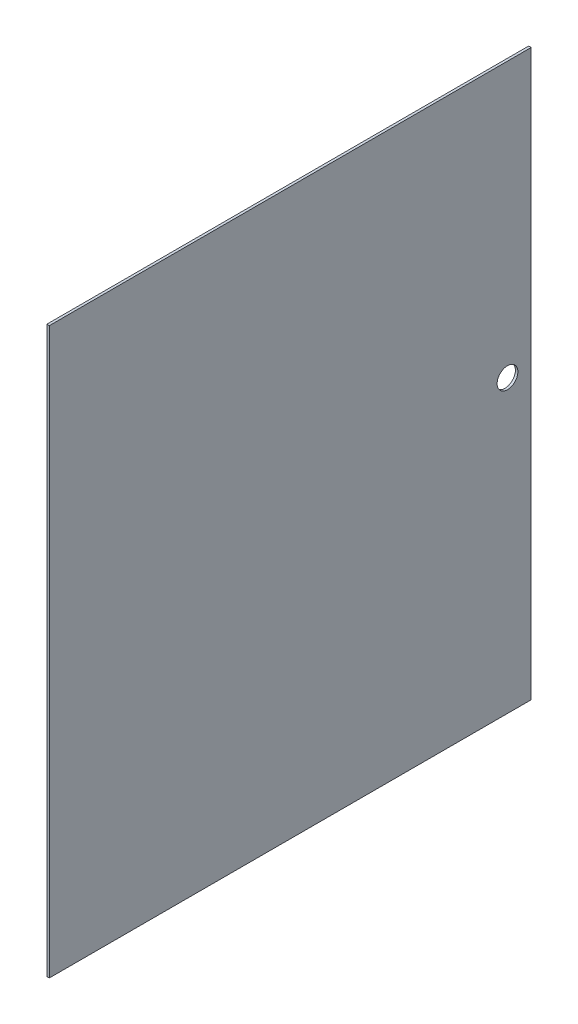
ISO-10303-21;
HEADER;
FILE_DESCRIPTION(('STEP AP214'),'2;1');
FILE_NAME('part.step','',(''),(''),'','','');
FILE_SCHEMA(('AUTOMOTIVE_DESIGN { 1 0 10303 214 1 1 1 1 }'));
ENDSEC;
DATA;
#1=APPLICATION_CONTEXT('core data for automotive mechanical design processes');
#2=APPLICATION_PROTOCOL_DEFINITION('international standard','automotive_design',2000,#1);
#3=PRODUCT_CONTEXT('',#1,'mechanical');
#4=PRODUCT('Part','Part','',(#3));
#5=PRODUCT_RELATED_PRODUCT_CATEGORY('part','',(#4));
#6=PRODUCT_DEFINITION_FORMATION('','',#4);
#7=PRODUCT_DEFINITION_CONTEXT('part definition',#1,'design');
#8=PRODUCT_DEFINITION('design','',#6,#7);
#9=PRODUCT_DEFINITION_SHAPE('','',#8);
#10=(LENGTH_UNIT() NAMED_UNIT(*) SI_UNIT(.MILLI.,.METRE.));
#11=(NAMED_UNIT(*) PLANE_ANGLE_UNIT() SI_UNIT($,.RADIAN.));
#12=(NAMED_UNIT(*) SI_UNIT($,.STERADIAN.) SOLID_ANGLE_UNIT());
#13=UNCERTAINTY_MEASURE_WITH_UNIT(LENGTH_MEASURE(1.E-05),#10,'distance_accuracy_value','');
#14=(GEOMETRIC_REPRESENTATION_CONTEXT(3) GLOBAL_UNCERTAINTY_ASSIGNED_CONTEXT((#13)) GLOBAL_UNIT_ASSIGNED_CONTEXT((#10,
#11,#12)) REPRESENTATION_CONTEXT('',''));
#15=CARTESIAN_POINT('',(0.,0.,0.));
#16=DIRECTION('',(0.,0.,1.));
#17=DIRECTION('',(1.,0.,0.));
#18=AXIS2_PLACEMENT_3D('',#15,#16,#17);
#19=CARTESIAN_POINT('',(3.,-340.,290.));
#20=DIRECTION('',(0.,0.,-1.));
#21=DIRECTION('',(-1.,0.,0.));
#22=AXIS2_PLACEMENT_3D('',#19,#20,#21);
#23=PLANE('',#22);
#24=DIRECTION('',(0.,-1.,0.));
#25=VECTOR('',#24,1.);
#26=CARTESIAN_POINT('',(0.,-340.,290.));
#27=LINE('',#26,#25);
#28=CARTESIAN_POINT('',(0.,340.,290.));
#29=VERTEX_POINT('',#28);
#30=CARTESIAN_POINT('',(0.,-340.,290.));
#31=VERTEX_POINT('',#30);
#32=EDGE_CURVE('E111',#29,#31,#27,.T.);
#33=ORIENTED_EDGE('',*,*,#32,.T.);
#34=DIRECTION('',(-1.,0.,0.));
#35=VECTOR('',#34,1.);
#36=CARTESIAN_POINT('',(3.,-340.,290.));
#37=LINE('',#36,#35);
#38=CARTESIAN_POINT('',(3.,-340.,290.));
#39=VERTEX_POINT('',#38);
#40=EDGE_CURVE('E11',#39,#31,#37,.T.);
#41=ORIENTED_EDGE('',*,*,#40,.F.);
#42=DIRECTION('',(0.,-1.,0.));
#43=VECTOR('',#42,1.);
#44=CARTESIAN_POINT('',(3.,-340.,290.));
#45=LINE('',#44,#43);
#46=CARTESIAN_POINT('',(3.,340.,290.));
#47=VERTEX_POINT('',#46);
#48=EDGE_CURVE('E95',#47,#39,#45,.T.);
#49=ORIENTED_EDGE('',*,*,#48,.F.);
#50=DIRECTION('',(-1.,0.,0.));
#51=VECTOR('',#50,1.);
#52=CARTESIAN_POINT('',(3.,340.,290.));
#53=LINE('',#52,#51);
#54=EDGE_CURVE('E107',#47,#29,#53,.T.);
#55=ORIENTED_EDGE('',*,*,#54,.T.);
#56=EDGE_LOOP('',(#33,#41,#49,#55));
#57=FACE_BOUND('',#56,.T.);
#58=ADVANCED_FACE('F43',(#57),#23,.F.);
#59=CARTESIAN_POINT('',(3.,-340.,-290.));
#60=DIRECTION('',(0.,1.,0.));
#61=DIRECTION('',(0.,0.,1.));
#62=AXIS2_PLACEMENT_3D('',#59,#60,#61);
#63=PLANE('',#62);
#64=DIRECTION('',(0.,0.,-1.));
#65=VECTOR('',#64,1.);
#66=CARTESIAN_POINT('',(0.,-340.,-290.));
#67=LINE('',#66,#65);
#68=CARTESIAN_POINT('',(0.,-340.,-290.));
#69=VERTEX_POINT('',#68);
#70=EDGE_CURVE('E100',#31,#69,#67,.T.);
#71=ORIENTED_EDGE('',*,*,#70,.T.);
#72=DIRECTION('',(-1.,0.,0.));
#73=VECTOR('',#72,1.);
#74=CARTESIAN_POINT('',(3.,-340.,-290.));
#75=LINE('',#74,#73);
#76=CARTESIAN_POINT('',(3.,-340.,-290.));
#77=VERTEX_POINT('',#76);
#78=EDGE_CURVE('E52',#77,#69,#75,.T.);
#79=ORIENTED_EDGE('',*,*,#78,.F.);
#80=DIRECTION('',(0.,0.,-1.));
#81=VECTOR('',#80,1.);
#82=CARTESIAN_POINT('',(3.,-340.,-290.));
#83=LINE('',#82,#81);
#84=EDGE_CURVE('E90',#39,#77,#83,.T.);
#85=ORIENTED_EDGE('',*,*,#84,.F.);
#86=ORIENTED_EDGE('',*,*,#40,.T.);
#87=EDGE_LOOP('',(#71,#79,#85,#86));
#88=FACE_BOUND('',#87,.T.);
#89=ADVANCED_FACE('F99',(#88),#63,.F.);
#90=CARTESIAN_POINT('',(3.,-340.,-290.));
#91=DIRECTION('',(0.,0.,1.));
#92=DIRECTION('',(1.,0.,0.));
#93=AXIS2_PLACEMENT_3D('',#90,#91,#92);
#94=PLANE('',#93);
#95=DIRECTION('',(0.,1.,0.));
#96=VECTOR('',#95,1.);
#97=CARTESIAN_POINT('',(0.,-340.,-290.));
#98=LINE('',#97,#96);
#99=CARTESIAN_POINT('',(0.,340.,-290.));
#100=VERTEX_POINT('',#99);
#101=EDGE_CURVE('E77',#69,#100,#98,.T.);
#102=ORIENTED_EDGE('',*,*,#101,.T.);
#103=DIRECTION('',(-1.,0.,0.));
#104=VECTOR('',#103,1.);
#105=CARTESIAN_POINT('',(3.,340.,-290.));
#106=LINE('',#105,#104);
#107=CARTESIAN_POINT('',(3.,340.,-290.));
#108=VERTEX_POINT('',#107);
#109=EDGE_CURVE('E102',#108,#100,#106,.T.);
#110=ORIENTED_EDGE('',*,*,#109,.F.);
#111=DIRECTION('',(0.,1.,0.));
#112=VECTOR('',#111,1.);
#113=CARTESIAN_POINT('',(3.,-340.,-290.));
#114=LINE('',#113,#112);
#115=EDGE_CURVE('E93',#77,#108,#114,.T.);
#116=ORIENTED_EDGE('',*,*,#115,.F.);
#117=ORIENTED_EDGE('',*,*,#78,.T.);
#118=EDGE_LOOP('',(#102,#110,#116,#117));
#119=FACE_BOUND('',#118,.T.);
#120=ADVANCED_FACE('F103',(#119),#94,.F.);
#121=CARTESIAN_POINT('',(3.,340.,-290.));
#122=DIRECTION('',(0.,-1.,0.));
#123=DIRECTION('',(0.,0.,-1.));
#124=AXIS2_PLACEMENT_3D('',#121,#122,#123);
#125=PLANE('',#124);
#126=DIRECTION('',(0.,0.,1.));
#127=VECTOR('',#126,1.);
#128=CARTESIAN_POINT('',(0.,340.,-290.));
#129=LINE('',#128,#127);
#130=EDGE_CURVE('E83',#100,#29,#129,.T.);
#131=ORIENTED_EDGE('',*,*,#130,.T.);
#132=ORIENTED_EDGE('',*,*,#54,.F.);
#133=DIRECTION('',(0.,0.,1.));
#134=VECTOR('',#133,1.);
#135=CARTESIAN_POINT('',(3.,340.,-290.));
#136=LINE('',#135,#134);
#137=EDGE_CURVE('E60',#108,#47,#136,.T.);
#138=ORIENTED_EDGE('',*,*,#137,.F.);
#139=ORIENTED_EDGE('',*,*,#109,.T.);
#140=EDGE_LOOP('',(#131,#132,#138,#139));
#141=FACE_BOUND('',#140,.T.);
#142=ADVANCED_FACE('F125',(#141),#125,.F.);
#143=CARTESIAN_POINT('',(3.,0.,0.));
#144=DIRECTION('',(1.,0.,0.));
#145=DIRECTION('',(0.,0.,-1.));
#146=AXIS2_PLACEMENT_3D('',#143,#144,#145);
#147=PLANE('',#146);
#148=CARTESIAN_POINT('',(3.,10.0000000000001,-261.5));
#149=DIRECTION('',(1.,0.,0.));
#150=DIRECTION('',(0.,0.,-1.));
#151=AXIS2_PLACEMENT_3D('',#148,#149,#150);
#152=CIRCLE('',#151,12.5);
#153=CARTESIAN_POINT('',(3.,10.0000000000001,-249.));
#154=VERTEX_POINT('',#153);
#155=EDGE_CURVE('E132',#154,#154,#152,.F.);
#156=ORIENTED_EDGE('',*,*,#155,.T.);
#157=EDGE_LOOP('',(#156));
#158=FACE_BOUND('',#157,.T.);
#159=ORIENTED_EDGE('',*,*,#48,.T.);
#160=ORIENTED_EDGE('',*,*,#84,.T.);
#161=ORIENTED_EDGE('',*,*,#115,.T.);
#162=ORIENTED_EDGE('',*,*,#137,.T.);
#163=EDGE_LOOP('',(#159,#160,#161,#162));
#164=FACE_BOUND('',#163,.T.);
#165=ADVANCED_FACE('F91',(#158,#164),#147,.T.);
#166=CARTESIAN_POINT('',(0.,0.,0.));
#167=DIRECTION('',(1.,0.,0.));
#168=DIRECTION('',(0.,0.,-1.));
#169=AXIS2_PLACEMENT_3D('',#166,#167,#168);
#170=PLANE('',#169);
#171=CARTESIAN_POINT('',(0.,10.0000000000001,-261.5));
#172=DIRECTION('',(-1.,0.,0.));
#173=DIRECTION('',(0.,0.,1.));
#174=AXIS2_PLACEMENT_3D('',#171,#172,#173);
#175=CIRCLE('',#174,12.5);
#176=CARTESIAN_POINT('',(0.,10.0000000000001,-249.));
#177=VERTEX_POINT('',#176);
#178=EDGE_CURVE('E115',#177,#177,#175,.T.);
#179=ORIENTED_EDGE('',*,*,#178,.F.);
#180=EDGE_LOOP('',(#179));
#181=FACE_BOUND('',#180,.T.);
#182=ORIENTED_EDGE('',*,*,#32,.F.);
#183=ORIENTED_EDGE('',*,*,#130,.F.);
#184=ORIENTED_EDGE('',*,*,#101,.F.);
#185=ORIENTED_EDGE('',*,*,#70,.F.);
#186=EDGE_LOOP('',(#182,#183,#184,#185));
#187=FACE_BOUND('',#186,.T.);
#188=ADVANCED_FACE('F128',(#181,#187),#170,.F.);
#189=CARTESIAN_POINT('',(3.001,10.0000000000001,-261.5));
#190=DIRECTION('',(-1.,0.,0.));
#191=DIRECTION('',(0.,0.,1.));
#192=AXIS2_PLACEMENT_3D('',#189,#190,#191);
#193=CYLINDRICAL_SURFACE('',#192,12.5);
#194=CARTESIAN_POINT('',(3.,10.0000000000001,-249.));
#195=CARTESIAN_POINT('',(2.96875,10.0000000000001,-249.));
#196=CARTESIAN_POINT('',(2.9375,10.0000000000001,-249.));
#197=CARTESIAN_POINT('',(2.875,10.0000000000001,-249.));
#198=CARTESIAN_POINT('',(2.84375,10.0000000000001,-249.));
#199=CARTESIAN_POINT('',(2.78125,10.0000000000001,-249.));
#200=CARTESIAN_POINT('',(2.75,10.0000000000001,-249.));
#201=CARTESIAN_POINT('',(2.6875,10.0000000000001,-249.));
#202=CARTESIAN_POINT('',(2.65625,10.0000000000001,-249.));
#203=CARTESIAN_POINT('',(2.59375,10.0000000000001,-249.));
#204=CARTESIAN_POINT('',(2.5625,10.0000000000001,-249.));
#205=CARTESIAN_POINT('',(2.5,10.0000000000001,-249.));
#206=CARTESIAN_POINT('',(2.46875,10.0000000000001,-249.));
#207=CARTESIAN_POINT('',(2.40625,10.0000000000001,-249.));
#208=CARTESIAN_POINT('',(2.375,10.0000000000001,-249.));
#209=CARTESIAN_POINT('',(2.3125,10.0000000000001,-249.));
#210=CARTESIAN_POINT('',(2.28125,10.0000000000001,-249.));
#211=CARTESIAN_POINT('',(2.21875,10.0000000000001,-249.));
#212=CARTESIAN_POINT('',(2.1875,10.0000000000001,-249.));
#213=CARTESIAN_POINT('',(2.125,10.0000000000001,-249.));
#214=CARTESIAN_POINT('',(2.09375,10.0000000000001,-249.));
#215=CARTESIAN_POINT('',(2.03125,10.0000000000001,-249.));
#216=CARTESIAN_POINT('',(2.,10.0000000000001,-249.));
#217=CARTESIAN_POINT('',(1.9375,10.0000000000001,-249.));
#218=CARTESIAN_POINT('',(1.90625,10.0000000000001,-249.));
#219=CARTESIAN_POINT('',(1.84375,10.0000000000001,-249.));
#220=CARTESIAN_POINT('',(1.8125,10.0000000000001,-249.));
#221=CARTESIAN_POINT('',(1.75,10.0000000000001,-249.));
#222=CARTESIAN_POINT('',(1.71875,10.0000000000001,-249.));
#223=CARTESIAN_POINT('',(1.65625,10.0000000000001,-249.));
#224=CARTESIAN_POINT('',(1.625,10.0000000000001,-249.));
#225=CARTESIAN_POINT('',(1.5625,10.0000000000001,-249.));
#226=CARTESIAN_POINT('',(1.53125,10.0000000000001,-249.));
#227=CARTESIAN_POINT('',(1.46875,10.0000000000001,-249.));
#228=CARTESIAN_POINT('',(1.4375,10.0000000000001,-249.));
#229=CARTESIAN_POINT('',(1.375,10.0000000000001,-249.));
#230=CARTESIAN_POINT('',(1.34375,10.0000000000001,-249.));
#231=CARTESIAN_POINT('',(1.28125,10.0000000000001,-249.));
#232=CARTESIAN_POINT('',(1.25,10.0000000000001,-249.));
#233=CARTESIAN_POINT('',(1.1875,10.0000000000001,-249.));
#234=CARTESIAN_POINT('',(1.15625,10.0000000000001,-249.));
#235=CARTESIAN_POINT('',(1.09375,10.0000000000001,-249.));
#236=CARTESIAN_POINT('',(1.0625,10.0000000000001,-249.));
#237=CARTESIAN_POINT('',(1.,10.0000000000001,-249.));
#238=CARTESIAN_POINT('',(0.96875,10.0000000000001,-249.));
#239=CARTESIAN_POINT('',(0.90625,10.0000000000001,-249.));
#240=CARTESIAN_POINT('',(0.875,10.0000000000001,-249.));
#241=CARTESIAN_POINT('',(0.8125,10.0000000000001,-249.));
#242=CARTESIAN_POINT('',(0.78125,10.0000000000001,-249.));
#243=CARTESIAN_POINT('',(0.71875,10.0000000000001,-249.));
#244=CARTESIAN_POINT('',(0.6875,10.0000000000001,-249.));
#245=CARTESIAN_POINT('',(0.625,10.0000000000001,-249.));
#246=CARTESIAN_POINT('',(0.59375,10.0000000000001,-249.));
#247=CARTESIAN_POINT('',(0.53125,10.0000000000001,-249.));
#248=CARTESIAN_POINT('',(0.5,10.0000000000001,-249.));
#249=CARTESIAN_POINT('',(0.4375,10.0000000000001,-249.));
#250=CARTESIAN_POINT('',(0.40625,10.0000000000001,-249.));
#251=CARTESIAN_POINT('',(0.34375,10.0000000000001,-249.));
#252=CARTESIAN_POINT('',(0.3125,10.0000000000001,-249.));
#253=CARTESIAN_POINT('',(0.25,10.0000000000001,-249.));
#254=CARTESIAN_POINT('',(0.21875,10.0000000000001,-249.));
#255=CARTESIAN_POINT('',(0.156250000000001,10.0000000000001,-249.));
#256=CARTESIAN_POINT('',(0.125000000000001,10.0000000000001,-249.));
#257=CARTESIAN_POINT('',(0.0625000000000005,10.0000000000001,-249.));
#258=CARTESIAN_POINT('',(0.0312500000000005,10.0000000000001,-249.));
#259=CARTESIAN_POINT('',(0.,10.0000000000001,-249.));
#260=B_SPLINE_CURVE_WITH_KNOTS('',3,(#194,#195,#196,#197,#198,#199,#200,#201,#202,#203,#204,
#205,#206,#207,#208,#209,#210,#211,#212,#213,#214,#215,#216,#217,#218,#219,#220,#221,#222,#223,
#224,#225,#226,#227,#228,#229,#230,#231,#232,#233,#234,#235,#236,#237,#238,#239,#240,#241,#242,
#243,#244,#245,#246,#247,#248,#249,#250,#251,#252,#253,#254,#255,#256,#257,#258,#259),
.UNSPECIFIED.,.F.,.F.,(4,2,2,2,2,2,2,2,2,2,2,2,2,2,2,2,2,2,2,2,2,2,2,2,2,2,2,2,2,2,2,2,4),(0.,
0.0937499999999997,0.1875,0.28125,0.375,0.46875,0.5625,0.65625,0.749999999999999,
0.843749999999999,0.9375,1.03125,1.125,1.21875,1.3125,1.40625,1.5,1.59375,1.6875,1.78125,1.875,
1.96875,2.0625,2.15625,2.25,2.34375,2.4375,2.53125,2.625,2.71875,2.8125,2.90625,3.),.UNSPECIFIED.);
#261=EDGE_CURVE('BSEAM140',#154,#177,#260,.T.);
#262=ORIENTED_EDGE('',*,*,#155,.F.);
#263=ORIENTED_EDGE('',*,*,#178,.T.);
#264=ORIENTED_EDGE('',*,*,#261,.T.);
#265=ORIENTED_EDGE('',*,*,#261,.F.);
#266=EDGE_LOOP('',(#262,#264,#263,#265));
#267=FACE_BOUND('',#266,.T.);
#268=ADVANCED_FACE('F140',(#267),#193,.F.);
#269=CLOSED_SHELL('',(#58,#89,#120,#142,#165,#188,#268));
#270=MANIFOLD_SOLID_BREP('B2',#269);
#271=ADVANCED_BREP_SHAPE_REPRESENTATION('',(#18,#270),#14);
#272=SHAPE_DEFINITION_REPRESENTATION(#9,#271);
ENDSEC;
END-ISO-10303-21;
